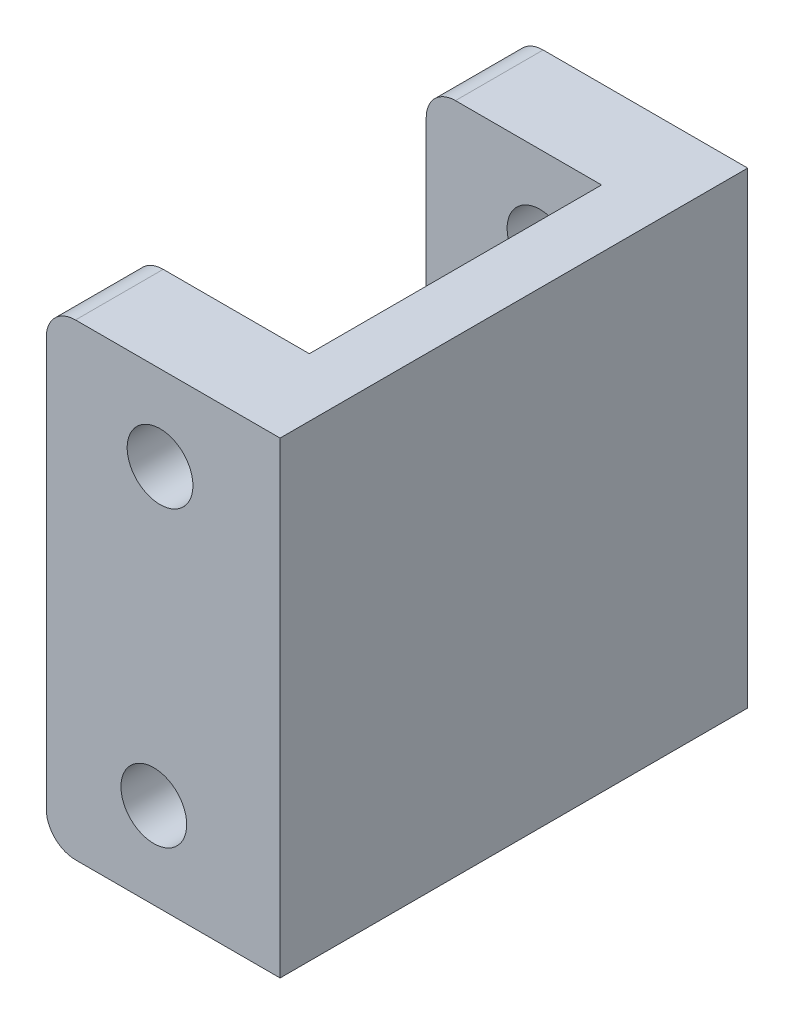
ISO-10303-21;
HEADER;
FILE_DESCRIPTION(('STEP AP214'),'2;1');
FILE_NAME('part.step','',(''),(''),'','','');
FILE_SCHEMA(('AUTOMOTIVE_DESIGN { 1 0 10303 214 1 1 1 1 }'));
ENDSEC;
DATA;
#1=APPLICATION_CONTEXT('core data for automotive mechanical design processes');
#2=APPLICATION_PROTOCOL_DEFINITION('international standard','automotive_design',2000,#1);
#3=PRODUCT_CONTEXT('',#1,'mechanical');
#4=PRODUCT('Part','Part','',(#3));
#5=PRODUCT_RELATED_PRODUCT_CATEGORY('part','',(#4));
#6=PRODUCT_DEFINITION_FORMATION('','',#4);
#7=PRODUCT_DEFINITION_CONTEXT('part definition',#1,'design');
#8=PRODUCT_DEFINITION('design','',#6,#7);
#9=PRODUCT_DEFINITION_SHAPE('','',#8);
#10=(LENGTH_UNIT() NAMED_UNIT(*) SI_UNIT(.MILLI.,.METRE.));
#11=(NAMED_UNIT(*) PLANE_ANGLE_UNIT() SI_UNIT($,.RADIAN.));
#12=(NAMED_UNIT(*) SI_UNIT($,.STERADIAN.) SOLID_ANGLE_UNIT());
#13=UNCERTAINTY_MEASURE_WITH_UNIT(LENGTH_MEASURE(1.E-05),#10,'distance_accuracy_value','');
#14=(GEOMETRIC_REPRESENTATION_CONTEXT(3) GLOBAL_UNCERTAINTY_ASSIGNED_CONTEXT((#13)) GLOBAL_UNIT_ASSIGNED_CONTEXT((#10,
#11,#12)) REPRESENTATION_CONTEXT('',''));
#15=CARTESIAN_POINT('',(0.,0.,0.));
#16=DIRECTION('',(0.,0.,1.));
#17=DIRECTION('',(1.,0.,0.));
#18=AXIS2_PLACEMENT_3D('',#15,#16,#17);
#19=CARTESIAN_POINT('',(0.,0.,-25.4));
#20=DIRECTION('',(0.,0.,-1.));
#21=DIRECTION('',(1.,0.,0.));
#22=AXIS2_PLACEMENT_3D('',#19,#20,#21);
#23=PLANE('',#22);
#24=CARTESIAN_POINT('',(-9.86684411418175,16.19103189858,-25.4));
#25=DIRECTION('',(0.,0.,1.));
#26=DIRECTION('',(1.,0.,0.));
#27=AXIS2_PLACEMENT_3D('',#24,#25,#26);
#28=CIRCLE('',#27,3.57123999999993);
#29=CARTESIAN_POINT('',(-6.29560411418182,16.19103189858,-25.4));
#30=VERTEX_POINT('',#29);
#31=EDGE_CURVE('E163',#30,#30,#28,.T.);
#32=ORIENTED_EDGE('',*,*,#31,.T.);
#33=EDGE_LOOP('',(#32));
#34=FACE_BOUND('',#33,.T.);
#35=DIRECTION('',(1.,0.,0.));
#36=VECTOR('',#35,1.);
#37=CARTESIAN_POINT('',(-3.175,-25.4,-25.4));
#38=LINE('',#37,#36);
#39=CARTESIAN_POINT('',(-19.05,-25.4,-25.4));
#40=VERTEX_POINT('',#39);
#41=CARTESIAN_POINT('',(3.175,-25.4,-25.4));
#42=VERTEX_POINT('',#41);
#43=EDGE_CURVE('E230',#40,#42,#38,.T.);
#44=ORIENTED_EDGE('',*,*,#43,.F.);
#45=CARTESIAN_POINT('',(-19.05,-22.225,-25.4));
#46=DIRECTION('',(0.,0.,-1.));
#47=DIRECTION('',(-1.,0.,0.));
#48=AXIS2_PLACEMENT_3D('',#45,#46,#47);
#49=CIRCLE('',#48,3.175);
#50=CARTESIAN_POINT('',(-22.225,-22.225,-25.4));
#51=VERTEX_POINT('',#50);
#52=EDGE_CURVE('E178',#40,#51,#49,.T.);
#53=ORIENTED_EDGE('',*,*,#52,.T.);
#54=DIRECTION('',(0.,-1.,0.));
#55=VECTOR('',#54,1.);
#56=CARTESIAN_POINT('',(-22.225,25.4,-25.4));
#57=LINE('',#56,#55);
#58=CARTESIAN_POINT('',(-22.225,22.225,-25.4));
#59=VERTEX_POINT('',#58);
#60=EDGE_CURVE('E245',#59,#51,#57,.T.);
#61=ORIENTED_EDGE('',*,*,#60,.F.);
#62=CARTESIAN_POINT('',(-19.05,22.225,-25.4));
#63=DIRECTION('',(0.,0.,-1.));
#64=DIRECTION('',(-1.,0.,0.));
#65=AXIS2_PLACEMENT_3D('',#62,#63,#64);
#66=CIRCLE('',#65,3.175);
#67=CARTESIAN_POINT('',(-19.05,25.4,-25.4));
#68=VERTEX_POINT('',#67);
#69=EDGE_CURVE('E176',#59,#68,#66,.T.);
#70=ORIENTED_EDGE('',*,*,#69,.T.);
#71=DIRECTION('',(-1.,0.,0.));
#72=VECTOR('',#71,1.);
#73=CARTESIAN_POINT('',(3.175,25.4,-25.4));
#74=LINE('',#73,#72);
#75=CARTESIAN_POINT('',(3.175,25.4,-25.4));
#76=VERTEX_POINT('',#75);
#77=EDGE_CURVE('E132',#76,#68,#74,.T.);
#78=ORIENTED_EDGE('',*,*,#77,.F.);
#79=DIRECTION('',(0.,1.,0.));
#80=VECTOR('',#79,1.);
#81=CARTESIAN_POINT('',(3.175,-25.4,-25.4));
#82=LINE('',#81,#80);
#83=EDGE_CURVE('E224',#42,#76,#82,.T.);
#84=ORIENTED_EDGE('',*,*,#83,.F.);
#85=EDGE_LOOP('',(#44,#53,#61,#70,#78,#84));
#86=FACE_BOUND('',#85,.T.);
#87=CARTESIAN_POINT('',(-10.5441089398352,-16.0417445976253,-25.4));
#88=DIRECTION('',(0.,0.,1.));
#89=DIRECTION('',(1.,0.,0.));
#90=AXIS2_PLACEMENT_3D('',#87,#88,#89);
#91=CIRCLE('',#90,3.57123999999993);
#92=CARTESIAN_POINT('',(-6.97286893983527,-16.0417445976253,-25.4));
#93=VERTEX_POINT('',#92);
#94=EDGE_CURVE('E256',#93,#93,#91,.T.);
#95=ORIENTED_EDGE('',*,*,#94,.T.);
#96=EDGE_LOOP('',(#95));
#97=FACE_BOUND('',#96,.T.);
#98=ADVANCED_FACE('F33',(#34,#86,#97),#23,.T.);
#99=CARTESIAN_POINT('',(-3.175,0.,0.));
#100=DIRECTION('',(1.,0.,0.));
#101=DIRECTION('',(0.,0.,-1.));
#102=AXIS2_PLACEMENT_3D('',#99,#100,#101);
#103=PLANE('',#102);
#104=DIRECTION('',(0.,1.,0.));
#105=VECTOR('',#104,1.);
#106=CARTESIAN_POINT('',(-3.175,0.,-15.875));
#107=LINE('',#106,#105);
#108=CARTESIAN_POINT('',(-3.175,-25.4,-15.875));
#109=VERTEX_POINT('',#108);
#110=CARTESIAN_POINT('',(-3.175,25.4,-15.875));
#111=VERTEX_POINT('',#110);
#112=EDGE_CURVE('E126',#109,#111,#107,.T.);
#113=ORIENTED_EDGE('',*,*,#112,.F.);
#114=DIRECTION('',(0.,0.,-1.));
#115=VECTOR('',#114,1.);
#116=CARTESIAN_POINT('',(-3.175,-25.4,12.7));
#117=LINE('',#116,#115);
#118=CARTESIAN_POINT('',(-3.175,-25.4,15.875));
#119=VERTEX_POINT('',#118);
#120=EDGE_CURVE('E139',#119,#109,#117,.T.);
#121=ORIENTED_EDGE('',*,*,#120,.F.);
#122=DIRECTION('',(0.,1.,0.));
#123=VECTOR('',#122,1.);
#124=CARTESIAN_POINT('',(-3.175,0.,15.875));
#125=LINE('',#124,#123);
#126=CARTESIAN_POINT('',(-3.175,25.4,15.875));
#127=VERTEX_POINT('',#126);
#128=EDGE_CURVE('E143',#119,#127,#125,.T.);
#129=ORIENTED_EDGE('',*,*,#128,.T.);
#130=DIRECTION('',(0.,0.,1.));
#131=VECTOR('',#130,1.);
#132=CARTESIAN_POINT('',(-3.175,25.4,12.7));
#133=LINE('',#132,#131);
#134=EDGE_CURVE('E141',#111,#127,#133,.T.);
#135=ORIENTED_EDGE('',*,*,#134,.F.);
#136=EDGE_LOOP('',(#113,#121,#129,#135));
#137=FACE_BOUND('',#136,.T.);
#138=ADVANCED_FACE('F137',(#137),#103,.F.);
#139=CARTESIAN_POINT('',(3.175,25.4,12.7));
#140=DIRECTION('',(0.,-1.,0.));
#141=DIRECTION('',(0.,0.,-1.));
#142=AXIS2_PLACEMENT_3D('',#139,#140,#141);
#143=PLANE('',#142);
#144=ORIENTED_EDGE('',*,*,#77,.T.);
#145=DIRECTION('',(0.,0.,-1.));
#146=VECTOR('',#145,1.);
#147=CARTESIAN_POINT('',(-19.05,25.4,12.7));
#148=LINE('',#147,#146);
#149=CARTESIAN_POINT('',(-19.05,25.4,-15.875));
#150=VERTEX_POINT('',#149);
#151=EDGE_CURVE('E183',#68,#150,#148,.F.);
#152=ORIENTED_EDGE('',*,*,#151,.T.);
#153=DIRECTION('',(1.,0.,0.));
#154=VECTOR('',#153,1.);
#155=CARTESIAN_POINT('',(-22.225,25.4,-15.875));
#156=LINE('',#155,#154);
#157=EDGE_CURVE('E133',#150,#111,#156,.T.);
#158=ORIENTED_EDGE('',*,*,#157,.T.);
#159=ORIENTED_EDGE('',*,*,#134,.T.);
#160=DIRECTION('',(1.,0.,0.));
#161=VECTOR('',#160,1.);
#162=CARTESIAN_POINT('',(-22.225,25.4,15.875));
#163=LINE('',#162,#161);
#164=CARTESIAN_POINT('',(-19.05,25.4,15.875));
#165=VERTEX_POINT('',#164);
#166=EDGE_CURVE('E208',#165,#127,#163,.T.);
#167=ORIENTED_EDGE('',*,*,#166,.F.);
#168=DIRECTION('',(0.,0.,1.));
#169=VECTOR('',#168,1.);
#170=CARTESIAN_POINT('',(-19.05,25.4,12.7));
#171=LINE('',#170,#169);
#172=CARTESIAN_POINT('',(-19.05,25.4,25.4));
#173=VERTEX_POINT('',#172);
#174=EDGE_CURVE('E180',#165,#173,#171,.T.);
#175=ORIENTED_EDGE('',*,*,#174,.T.);
#176=DIRECTION('',(-1.,0.,0.));
#177=VECTOR('',#176,1.);
#178=CARTESIAN_POINT('',(3.175,25.4,25.4));
#179=LINE('',#178,#177);
#180=CARTESIAN_POINT('',(3.175,25.4,25.4));
#181=VERTEX_POINT('',#180);
#182=EDGE_CURVE('E207',#181,#173,#179,.T.);
#183=ORIENTED_EDGE('',*,*,#182,.F.);
#184=DIRECTION('',(0.,0.,1.));
#185=VECTOR('',#184,1.);
#186=CARTESIAN_POINT('',(3.175,25.4,12.7));
#187=LINE('',#186,#185);
#188=EDGE_CURVE('E150',#76,#181,#187,.T.);
#189=ORIENTED_EDGE('',*,*,#188,.F.);
#190=EDGE_LOOP('',(#144,#152,#158,#159,#167,#175,#183,#189));
#191=FACE_BOUND('',#190,.T.);
#192=ADVANCED_FACE('F206',(#191),#143,.F.);
#193=CARTESIAN_POINT('',(3.175,-25.4,12.7));
#194=DIRECTION('',(0.,1.,0.));
#195=DIRECTION('',(0.,0.,1.));
#196=AXIS2_PLACEMENT_3D('',#193,#194,#195);
#197=PLANE('',#196);
#198=DIRECTION('',(1.,0.,0.));
#199=VECTOR('',#198,1.);
#200=CARTESIAN_POINT('',(-22.225,-25.4,-15.875));
#201=LINE('',#200,#199);
#202=CARTESIAN_POINT('',(-19.05,-25.4,-15.875));
#203=VERTEX_POINT('',#202);
#204=EDGE_CURVE('E121',#203,#109,#201,.T.);
#205=ORIENTED_EDGE('',*,*,#204,.F.);
#206=DIRECTION('',(0.,0.,1.));
#207=VECTOR('',#206,1.);
#208=CARTESIAN_POINT('',(-19.05,-25.4,12.7));
#209=LINE('',#208,#207);
#210=EDGE_CURVE('E174',#203,#40,#209,.F.);
#211=ORIENTED_EDGE('',*,*,#210,.T.);
#212=ORIENTED_EDGE('',*,*,#43,.T.);
#213=DIRECTION('',(0.,0.,-1.));
#214=VECTOR('',#213,1.);
#215=CARTESIAN_POINT('',(3.175,-25.4,12.7));
#216=LINE('',#215,#214);
#217=CARTESIAN_POINT('',(3.175,-25.4,25.4));
#218=VERTEX_POINT('',#217);
#219=EDGE_CURVE('E152',#218,#42,#216,.T.);
#220=ORIENTED_EDGE('',*,*,#219,.F.);
#221=DIRECTION('',(1.,0.,0.));
#222=VECTOR('',#221,1.);
#223=CARTESIAN_POINT('',(-3.175,-25.4,25.4));
#224=LINE('',#223,#222);
#225=CARTESIAN_POINT('',(-19.05,-25.4,25.4));
#226=VERTEX_POINT('',#225);
#227=EDGE_CURVE('E212',#226,#218,#224,.T.);
#228=ORIENTED_EDGE('',*,*,#227,.F.);
#229=DIRECTION('',(0.,0.,-1.));
#230=VECTOR('',#229,1.);
#231=CARTESIAN_POINT('',(-19.05,-25.4,12.7));
#232=LINE('',#231,#230);
#233=CARTESIAN_POINT('',(-19.05,-25.4,15.875));
#234=VERTEX_POINT('',#233);
#235=EDGE_CURVE('E172',#226,#234,#232,.T.);
#236=ORIENTED_EDGE('',*,*,#235,.T.);
#237=DIRECTION('',(1.,0.,0.));
#238=VECTOR('',#237,1.);
#239=CARTESIAN_POINT('',(-22.225,-25.4,15.875));
#240=LINE('',#239,#238);
#241=EDGE_CURVE('E148',#234,#119,#240,.T.);
#242=ORIENTED_EDGE('',*,*,#241,.T.);
#243=ORIENTED_EDGE('',*,*,#120,.T.);
#244=EDGE_LOOP('',(#205,#211,#212,#220,#228,#236,#242,#243));
#245=FACE_BOUND('',#244,.T.);
#246=ADVANCED_FACE('F145',(#245),#197,.F.);
#247=CARTESIAN_POINT('',(3.175,0.,0.));
#248=DIRECTION('',(1.,0.,0.));
#249=DIRECTION('',(0.,0.,-1.));
#250=AXIS2_PLACEMENT_3D('',#247,#248,#249);
#251=PLANE('',#250);
#252=ORIENTED_EDGE('',*,*,#188,.T.);
#253=DIRECTION('',(0.,1.,0.));
#254=VECTOR('',#253,1.);
#255=CARTESIAN_POINT('',(3.175,-25.4,25.4));
#256=LINE('',#255,#254);
#257=EDGE_CURVE('E154',#218,#181,#256,.T.);
#258=ORIENTED_EDGE('',*,*,#257,.F.);
#259=ORIENTED_EDGE('',*,*,#219,.T.);
#260=ORIENTED_EDGE('',*,*,#83,.T.);
#261=EDGE_LOOP('',(#252,#258,#259,#260));
#262=FACE_BOUND('',#261,.T.);
#263=ADVANCED_FACE('F223',(#262),#251,.T.);
#264=CARTESIAN_POINT('',(0.,0.,25.4));
#265=DIRECTION('',(0.,0.,1.));
#266=DIRECTION('',(1.,0.,0.));
#267=AXIS2_PLACEMENT_3D('',#264,#265,#266);
#268=PLANE('',#267);
#269=CARTESIAN_POINT('',(-9.86684411418175,16.19103189858,25.4));
#270=DIRECTION('',(0.,0.,1.));
#271=DIRECTION('',(1.,0.,0.));
#272=AXIS2_PLACEMENT_3D('',#269,#270,#271);
#273=CIRCLE('',#272,3.57123999999999);
#274=CARTESIAN_POINT('',(-6.29560411418177,16.19103189858,25.4));
#275=VERTEX_POINT('',#274);
#276=EDGE_CURVE('E266',#275,#275,#273,.T.);
#277=ORIENTED_EDGE('',*,*,#276,.F.);
#278=EDGE_LOOP('',(#277));
#279=FACE_BOUND('',#278,.T.);
#280=CARTESIAN_POINT('',(-10.5441089398352,-16.0417445976253,25.4));
#281=DIRECTION('',(0.,0.,1.));
#282=DIRECTION('',(1.,0.,0.));
#283=AXIS2_PLACEMENT_3D('',#280,#281,#282);
#284=CIRCLE('',#283,3.57123999999999);
#285=CARTESIAN_POINT('',(-6.97286893983522,-16.0417445976253,25.4));
#286=VERTEX_POINT('',#285);
#287=EDGE_CURVE('E259',#286,#286,#284,.T.);
#288=ORIENTED_EDGE('',*,*,#287,.F.);
#289=EDGE_LOOP('',(#288));
#290=FACE_BOUND('',#289,.T.);
#291=DIRECTION('',(0.,-1.,0.));
#292=VECTOR('',#291,1.);
#293=CARTESIAN_POINT('',(-22.225,25.4,25.4));
#294=LINE('',#293,#292);
#295=CARTESIAN_POINT('',(-22.225,22.225,25.4));
#296=VERTEX_POINT('',#295);
#297=CARTESIAN_POINT('',(-22.225,-22.225,25.4));
#298=VERTEX_POINT('',#297);
#299=EDGE_CURVE('E195',#296,#298,#294,.T.);
#300=ORIENTED_EDGE('',*,*,#299,.T.);
#301=CARTESIAN_POINT('',(-19.05,-22.225,25.4));
#302=DIRECTION('',(0.,0.,1.));
#303=DIRECTION('',(1.,0.,0.));
#304=AXIS2_PLACEMENT_3D('',#301,#302,#303);
#305=CIRCLE('',#304,3.175);
#306=EDGE_CURVE('E11',#298,#226,#305,.T.);
#307=ORIENTED_EDGE('',*,*,#306,.T.);
#308=ORIENTED_EDGE('',*,*,#227,.T.);
#309=ORIENTED_EDGE('',*,*,#257,.T.);
#310=ORIENTED_EDGE('',*,*,#182,.T.);
#311=CARTESIAN_POINT('',(-19.05,22.225,25.4));
#312=DIRECTION('',(0.,0.,1.));
#313=DIRECTION('',(1.,0.,0.));
#314=AXIS2_PLACEMENT_3D('',#311,#312,#313);
#315=CIRCLE('',#314,3.175);
#316=EDGE_CURVE('E41',#173,#296,#315,.T.);
#317=ORIENTED_EDGE('',*,*,#316,.T.);
#318=EDGE_LOOP('',(#300,#307,#308,#309,#310,#317));
#319=FACE_BOUND('',#318,.T.);
#320=ADVANCED_FACE('F210',(#279,#290,#319),#268,.T.);
#321=CARTESIAN_POINT('',(-22.225,25.4,15.875));
#322=DIRECTION('',(0.,0.,-1.));
#323=DIRECTION('',(0.,1.,0.));
#324=AXIS2_PLACEMENT_3D('',#321,#322,#323);
#325=PLANE('',#324);
#326=CARTESIAN_POINT('',(-9.86684411418175,16.19103189858,15.875));
#327=DIRECTION('',(0.,0.,-1.));
#328=DIRECTION('',(0.,1.,0.));
#329=AXIS2_PLACEMENT_3D('',#326,#327,#328);
#330=CIRCLE('',#329,3.57123999999996);
#331=CARTESIAN_POINT('',(-9.86684411418175,19.7622718985799,15.875));
#332=VERTEX_POINT('',#331);
#333=EDGE_CURVE('E159',#332,#332,#330,.T.);
#334=ORIENTED_EDGE('',*,*,#333,.F.);
#335=EDGE_LOOP('',(#334));
#336=FACE_BOUND('',#335,.T.);
#337=CARTESIAN_POINT('',(-10.5441089398352,-16.0417445976253,15.875));
#338=DIRECTION('',(0.,0.,-1.));
#339=DIRECTION('',(0.,1.,0.));
#340=AXIS2_PLACEMENT_3D('',#337,#338,#339);
#341=CIRCLE('',#340,3.57123999999996);
#342=CARTESIAN_POINT('',(-10.5441089398352,-12.4705045976253,15.875));
#343=VERTEX_POINT('',#342);
#344=EDGE_CURVE('E250',#343,#343,#341,.T.);
#345=ORIENTED_EDGE('',*,*,#344,.F.);
#346=EDGE_LOOP('',(#345));
#347=FACE_BOUND('',#346,.T.);
#348=ORIENTED_EDGE('',*,*,#241,.F.);
#349=CARTESIAN_POINT('',(-19.05,-22.225,15.875));
#350=DIRECTION('',(0.,0.,-1.));
#351=DIRECTION('',(0.,1.,0.));
#352=AXIS2_PLACEMENT_3D('',#349,#350,#351);
#353=CIRCLE('',#352,3.175);
#354=CARTESIAN_POINT('',(-22.225,-22.225,15.875));
#355=VERTEX_POINT('',#354);
#356=EDGE_CURVE('E187',#234,#355,#353,.T.);
#357=ORIENTED_EDGE('',*,*,#356,.T.);
#358=DIRECTION('',(0.,1.,0.));
#359=VECTOR('',#358,1.);
#360=CARTESIAN_POINT('',(-22.225,25.4,15.875));
#361=LINE('',#360,#359);
#362=CARTESIAN_POINT('',(-22.225,22.225,15.875));
#363=VERTEX_POINT('',#362);
#364=EDGE_CURVE('E194',#355,#363,#361,.T.);
#365=ORIENTED_EDGE('',*,*,#364,.T.);
#366=CARTESIAN_POINT('',(-19.05,22.225,15.875));
#367=DIRECTION('',(0.,0.,-1.));
#368=DIRECTION('',(0.,1.,0.));
#369=AXIS2_PLACEMENT_3D('',#366,#367,#368);
#370=CIRCLE('',#369,3.175);
#371=EDGE_CURVE('E185',#363,#165,#370,.T.);
#372=ORIENTED_EDGE('',*,*,#371,.T.);
#373=ORIENTED_EDGE('',*,*,#166,.T.);
#374=ORIENTED_EDGE('',*,*,#128,.F.);
#375=EDGE_LOOP('',(#348,#357,#365,#372,#373,#374));
#376=FACE_BOUND('',#375,.T.);
#377=ADVANCED_FACE('F199',(#336,#347,#376),#325,.T.);
#378=CARTESIAN_POINT('',(-22.225,0.,0.));
#379=DIRECTION('',(1.,0.,0.));
#380=DIRECTION('',(0.,0.,-1.));
#381=AXIS2_PLACEMENT_3D('',#378,#379,#380);
#382=PLANE('',#381);
#383=ORIENTED_EDGE('',*,*,#364,.F.);
#384=DIRECTION('',(0.,0.,-1.));
#385=VECTOR('',#384,1.);
#386=CARTESIAN_POINT('',(-22.225,-22.225,0.));
#387=LINE('',#386,#385);
#388=EDGE_CURVE('E48',#355,#298,#387,.F.);
#389=ORIENTED_EDGE('',*,*,#388,.T.);
#390=ORIENTED_EDGE('',*,*,#299,.F.);
#391=DIRECTION('',(0.,0.,1.));
#392=VECTOR('',#391,1.);
#393=CARTESIAN_POINT('',(-22.225,22.225,0.));
#394=LINE('',#393,#392);
#395=EDGE_CURVE('E189',#296,#363,#394,.F.);
#396=ORIENTED_EDGE('',*,*,#395,.T.);
#397=EDGE_LOOP('',(#383,#389,#390,#396));
#398=FACE_BOUND('',#397,.T.);
#399=ADVANCED_FACE('F193',(#398),#382,.F.);
#400=CARTESIAN_POINT('',(-22.225,25.4,-15.875));
#401=DIRECTION('',(0.,0.,-1.));
#402=DIRECTION('',(0.,1.,0.));
#403=AXIS2_PLACEMENT_3D('',#400,#401,#402);
#404=PLANE('',#403);
#405=CARTESIAN_POINT('',(-9.86684411418175,16.19103189858,-15.875));
#406=DIRECTION('',(0.,0.,-1.));
#407=DIRECTION('',(0.,1.,0.));
#408=AXIS2_PLACEMENT_3D('',#405,#406,#407);
#409=CIRCLE('',#408,3.57123999999996);
#410=CARTESIAN_POINT('',(-9.86684411418175,19.7622718985799,-15.875));
#411=VERTEX_POINT('',#410);
#412=EDGE_CURVE('E162',#411,#411,#409,.T.);
#413=ORIENTED_EDGE('',*,*,#412,.T.);
#414=EDGE_LOOP('',(#413));
#415=FACE_BOUND('',#414,.T.);
#416=CARTESIAN_POINT('',(-10.5441089398352,-16.0417445976253,-15.875));
#417=DIRECTION('',(0.,0.,-1.));
#418=DIRECTION('',(0.,1.,0.));
#419=AXIS2_PLACEMENT_3D('',#416,#417,#418);
#420=CIRCLE('',#419,3.57123999999996);
#421=CARTESIAN_POINT('',(-10.5441089398352,-12.4705045976253,-15.875));
#422=VERTEX_POINT('',#421);
#423=EDGE_CURVE('E253',#422,#422,#420,.T.);
#424=ORIENTED_EDGE('',*,*,#423,.T.);
#425=EDGE_LOOP('',(#424));
#426=FACE_BOUND('',#425,.T.);
#427=DIRECTION('',(0.,1.,0.));
#428=VECTOR('',#427,1.);
#429=CARTESIAN_POINT('',(-22.225,25.4,-15.875));
#430=LINE('',#429,#428);
#431=CARTESIAN_POINT('',(-22.225,-22.225,-15.875));
#432=VERTEX_POINT('',#431);
#433=CARTESIAN_POINT('',(-22.225,22.225,-15.875));
#434=VERTEX_POINT('',#433);
#435=EDGE_CURVE('E243',#432,#434,#430,.T.);
#436=ORIENTED_EDGE('',*,*,#435,.F.);
#437=CARTESIAN_POINT('',(-19.05,-22.225,-15.875));
#438=DIRECTION('',(0.,0.,-1.));
#439=DIRECTION('',(0.,1.,0.));
#440=AXIS2_PLACEMENT_3D('',#437,#438,#439);
#441=CIRCLE('',#440,3.175);
#442=EDGE_CURVE('E128',#432,#203,#441,.F.);
#443=ORIENTED_EDGE('',*,*,#442,.T.);
#444=ORIENTED_EDGE('',*,*,#204,.T.);
#445=ORIENTED_EDGE('',*,*,#112,.T.);
#446=ORIENTED_EDGE('',*,*,#157,.F.);
#447=CARTESIAN_POINT('',(-19.05,22.225,-15.875));
#448=DIRECTION('',(0.,0.,-1.));
#449=DIRECTION('',(0.,1.,0.));
#450=AXIS2_PLACEMENT_3D('',#447,#448,#449);
#451=CIRCLE('',#450,3.175);
#452=EDGE_CURVE('E169',#150,#434,#451,.F.);
#453=ORIENTED_EDGE('',*,*,#452,.T.);
#454=EDGE_LOOP('',(#436,#443,#444,#445,#446,#453));
#455=FACE_BOUND('',#454,.T.);
#456=ADVANCED_FACE('F124',(#415,#426,#455),#404,.F.);
#457=CARTESIAN_POINT('',(-22.225,0.,0.));
#458=DIRECTION('',(1.,0.,0.));
#459=DIRECTION('',(0.,0.,1.));
#460=AXIS2_PLACEMENT_3D('',#457,#458,#459);
#461=PLANE('',#460);
#462=ORIENTED_EDGE('',*,*,#60,.T.);
#463=DIRECTION('',(0.,0.,1.));
#464=VECTOR('',#463,1.);
#465=CARTESIAN_POINT('',(-22.225,-22.225,0.));
#466=LINE('',#465,#464);
#467=EDGE_CURVE('E166',#51,#432,#466,.T.);
#468=ORIENTED_EDGE('',*,*,#467,.T.);
#469=ORIENTED_EDGE('',*,*,#435,.T.);
#470=DIRECTION('',(0.,0.,-1.));
#471=VECTOR('',#470,1.);
#472=CARTESIAN_POINT('',(-22.225,22.225,0.));
#473=LINE('',#472,#471);
#474=EDGE_CURVE('E142',#434,#59,#473,.T.);
#475=ORIENTED_EDGE('',*,*,#474,.T.);
#476=EDGE_LOOP('',(#462,#468,#469,#475));
#477=FACE_BOUND('',#476,.T.);
#478=ADVANCED_FACE('F280',(#477),#461,.F.);
#479=CARTESIAN_POINT('',(-10.5441089398352,-16.0417445976253,25.4));
#480=DIRECTION('',(0.,0.,1.));
#481=DIRECTION('',(1.,0.,0.));
#482=AXIS2_PLACEMENT_3D('',#479,#480,#481);
#483=CYLINDRICAL_SURFACE('',#482,3.57123999999996);
#484=ORIENTED_EDGE('',*,*,#344,.T.);
#485=EDGE_LOOP('',(#484));
#486=FACE_BOUND('',#485,.T.);
#487=ORIENTED_EDGE('',*,*,#287,.T.);
#488=EDGE_LOOP('',(#487));
#489=FACE_BOUND('',#488,.T.);
#490=ADVANCED_FACE('F277',(#486,#489),#483,.F.);
#491=ORIENTED_EDGE('',*,*,#94,.F.);
#492=EDGE_LOOP('',(#491));
#493=FACE_BOUND('',#492,.T.);
#494=ORIENTED_EDGE('',*,*,#423,.F.);
#495=EDGE_LOOP('',(#494));
#496=FACE_BOUND('',#495,.T.);
#497=ADVANCED_FACE('F279',(#493,#496),#483,.F.);
#498=CARTESIAN_POINT('',(-9.86684411418175,16.19103189858,25.4));
#499=DIRECTION('',(0.,0.,1.));
#500=DIRECTION('',(1.,0.,0.));
#501=AXIS2_PLACEMENT_3D('',#498,#499,#500);
#502=CYLINDRICAL_SURFACE('',#501,3.57123999999996);
#503=ORIENTED_EDGE('',*,*,#333,.T.);
#504=EDGE_LOOP('',(#503));
#505=FACE_BOUND('',#504,.T.);
#506=ORIENTED_EDGE('',*,*,#276,.T.);
#507=EDGE_LOOP('',(#506));
#508=FACE_BOUND('',#507,.T.);
#509=ADVANCED_FACE('F270',(#505,#508),#502,.F.);
#510=ORIENTED_EDGE('',*,*,#31,.F.);
#511=EDGE_LOOP('',(#510));
#512=FACE_BOUND('',#511,.T.);
#513=ORIENTED_EDGE('',*,*,#412,.F.);
#514=EDGE_LOOP('',(#513));
#515=FACE_BOUND('',#514,.T.);
#516=ADVANCED_FACE('F317',(#512,#515),#502,.F.);
#517=CARTESIAN_POINT('',(-19.05,-22.225,0.));
#518=DIRECTION('',(0.,0.,1.));
#519=DIRECTION('',(1.,0.,0.));
#520=AXIS2_PLACEMENT_3D('',#517,#518,#519);
#521=CYLINDRICAL_SURFACE('',#520,3.175);
#522=ORIENTED_EDGE('',*,*,#52,.F.);
#523=ORIENTED_EDGE('',*,*,#210,.F.);
#524=ORIENTED_EDGE('',*,*,#442,.F.);
#525=ORIENTED_EDGE('',*,*,#467,.F.);
#526=EDGE_LOOP('',(#522,#523,#524,#525));
#527=FACE_BOUND('',#526,.T.);
#528=ADVANCED_FACE('F313',(#527),#521,.T.);
#529=CARTESIAN_POINT('',(-19.05,22.225,0.));
#530=DIRECTION('',(0.,0.,-1.));
#531=DIRECTION('',(-1.,0.,0.));
#532=AXIS2_PLACEMENT_3D('',#529,#530,#531);
#533=CYLINDRICAL_SURFACE('',#532,3.175);
#534=ORIENTED_EDGE('',*,*,#452,.F.);
#535=ORIENTED_EDGE('',*,*,#151,.F.);
#536=ORIENTED_EDGE('',*,*,#69,.F.);
#537=ORIENTED_EDGE('',*,*,#474,.F.);
#538=EDGE_LOOP('',(#534,#535,#536,#537));
#539=FACE_BOUND('',#538,.T.);
#540=ADVANCED_FACE('F316',(#539),#533,.T.);
#541=CARTESIAN_POINT('',(-19.05,-22.225,12.7));
#542=DIRECTION('',(0.,0.,-1.));
#543=DIRECTION('',(-1.,0.,0.));
#544=AXIS2_PLACEMENT_3D('',#541,#542,#543);
#545=CYLINDRICAL_SURFACE('',#544,3.175);
#546=ORIENTED_EDGE('',*,*,#306,.F.);
#547=ORIENTED_EDGE('',*,*,#388,.F.);
#548=ORIENTED_EDGE('',*,*,#356,.F.);
#549=ORIENTED_EDGE('',*,*,#235,.F.);
#550=EDGE_LOOP('',(#546,#547,#548,#549));
#551=FACE_BOUND('',#550,.T.);
#552=ADVANCED_FACE('F240',(#551),#545,.T.);
#553=CARTESIAN_POINT('',(-19.05,22.225,12.7));
#554=DIRECTION('',(0.,0.,1.));
#555=DIRECTION('',(1.,0.,0.));
#556=AXIS2_PLACEMENT_3D('',#553,#554,#555);
#557=CYLINDRICAL_SURFACE('',#556,3.175);
#558=ORIENTED_EDGE('',*,*,#371,.F.);
#559=ORIENTED_EDGE('',*,*,#395,.F.);
#560=ORIENTED_EDGE('',*,*,#316,.F.);
#561=ORIENTED_EDGE('',*,*,#174,.F.);
#562=EDGE_LOOP('',(#558,#559,#560,#561));
#563=FACE_BOUND('',#562,.T.);
#564=ADVANCED_FACE('F35',(#563),#557,.T.);
#565=CLOSED_SHELL('',(#98,#138,#192,#246,#263,#320,#377,#399,#456,#478,#490,#497,#509,#516,#528,
#540,#552,#564));
#566=MANIFOLD_SOLID_BREP('B2',#565);
#567=ADVANCED_BREP_SHAPE_REPRESENTATION('',(#18,#566),#14);
#568=SHAPE_DEFINITION_REPRESENTATION(#9,#567);
ENDSEC;
END-ISO-10303-21;
